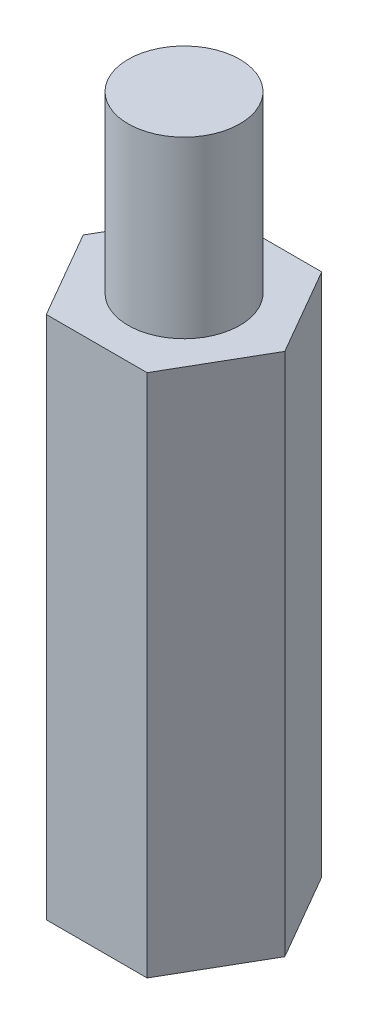
ISO-10303-21;
HEADER;
FILE_DESCRIPTION(('STEP AP214'),'2;1');
FILE_NAME('part.step','',(''),(''),'','','');
FILE_SCHEMA(('AUTOMOTIVE_DESIGN { 1 0 10303 214 1 1 1 1 }'));
ENDSEC;
DATA;
#1=APPLICATION_CONTEXT('core data for automotive mechanical design processes');
#2=APPLICATION_PROTOCOL_DEFINITION('international standard','automotive_design',2000,#1);
#3=PRODUCT_CONTEXT('',#1,'mechanical');
#4=PRODUCT('Part','Part','',(#3));
#5=PRODUCT_RELATED_PRODUCT_CATEGORY('part','',(#4));
#6=PRODUCT_DEFINITION_FORMATION('','',#4);
#7=PRODUCT_DEFINITION_CONTEXT('part definition',#1,'design');
#8=PRODUCT_DEFINITION('design','',#6,#7);
#9=PRODUCT_DEFINITION_SHAPE('','',#8);
#10=(LENGTH_UNIT() NAMED_UNIT(*) SI_UNIT(.MILLI.,.METRE.));
#11=(NAMED_UNIT(*) PLANE_ANGLE_UNIT() SI_UNIT($,.RADIAN.));
#12=(NAMED_UNIT(*) SI_UNIT($,.STERADIAN.) SOLID_ANGLE_UNIT());
#13=UNCERTAINTY_MEASURE_WITH_UNIT(LENGTH_MEASURE(1.E-05),#10,'distance_accuracy_value','');
#14=(GEOMETRIC_REPRESENTATION_CONTEXT(3) GLOBAL_UNCERTAINTY_ASSIGNED_CONTEXT((#13)) GLOBAL_UNIT_ASSIGNED_CONTEXT((#10,
#11,#12)) REPRESENTATION_CONTEXT('',''));
#15=CARTESIAN_POINT('',(0.,0.,0.));
#16=DIRECTION('',(0.,0.,1.));
#17=DIRECTION('',(1.,0.,0.));
#18=AXIS2_PLACEMENT_3D('',#15,#16,#17);
#19=CARTESIAN_POINT('',(-2.74963065701553,14.3002,0.));
#20=DIRECTION('',(0.866025403784445,0.,0.499999999999989));
#21=DIRECTION('',(0.499999999999989,0.,-0.866025403784445));
#22=AXIS2_PLACEMENT_3D('',#19,#20,#21);
#23=PLANE('',#22);
#24=DIRECTION('',(-0.499999999999989,0.,0.866025403784445));
#25=VECTOR('',#24,1.);
#26=CARTESIAN_POINT('',(-2.74963065701553,0.,0.));
#27=LINE('',#26,#25);
#28=CARTESIAN_POINT('',(-1.37481532850777,0.,-2.38124999999999));
#29=VERTEX_POINT('',#28);
#30=CARTESIAN_POINT('',(-2.74963065701553,0.,0.));
#31=VERTEX_POINT('',#30);
#32=EDGE_CURVE('E119',#29,#31,#27,.T.);
#33=ORIENTED_EDGE('',*,*,#32,.T.);
#34=DIRECTION('',(0.,-1.,0.));
#35=VECTOR('',#34,1.);
#36=CARTESIAN_POINT('',(-2.74963065701553,14.3002,0.));
#37=LINE('',#36,#35);
#38=CARTESIAN_POINT('',(-2.74963065701553,14.3002,0.));
#39=VERTEX_POINT('',#38);
#40=EDGE_CURVE('E36',#39,#31,#37,.T.);
#41=ORIENTED_EDGE('',*,*,#40,.F.);
#42=DIRECTION('',(-0.499999999999989,0.,0.866025403784445));
#43=VECTOR('',#42,1.);
#44=CARTESIAN_POINT('',(-2.74963065701553,14.3002,0.));
#45=LINE('',#44,#43);
#46=CARTESIAN_POINT('',(-1.37481532850777,14.3002,-2.38124999999999));
#47=VERTEX_POINT('',#46);
#48=EDGE_CURVE('E130',#47,#39,#45,.T.);
#49=ORIENTED_EDGE('',*,*,#48,.F.);
#50=DIRECTION('',(0.,-1.,0.));
#51=VECTOR('',#50,1.);
#52=CARTESIAN_POINT('',(-1.37481532850777,14.3002,-2.38124999999999));
#53=LINE('',#52,#51);
#54=EDGE_CURVE('E115',#47,#29,#53,.T.);
#55=ORIENTED_EDGE('',*,*,#54,.T.);
#56=EDGE_LOOP('',(#33,#41,#49,#55));
#57=FACE_BOUND('',#56,.T.);
#58=ADVANCED_FACE('F33',(#57),#23,.F.);
#59=CARTESIAN_POINT('',(-1.37481532850777,14.3002,2.38125000000002));
#60=DIRECTION('',(0.866025403784446,0.,-0.499999999999988));
#61=DIRECTION('',(-0.499999999999988,0.,-0.866025403784446));
#62=AXIS2_PLACEMENT_3D('',#59,#60,#61);
#63=PLANE('',#62);
#64=DIRECTION('',(0.499999999999988,0.,0.866025403784446));
#65=VECTOR('',#64,1.);
#66=CARTESIAN_POINT('',(-1.37481532850777,0.,2.38125000000002));
#67=LINE('',#66,#65);
#68=CARTESIAN_POINT('',(-1.37481532850777,0.,2.38125000000002));
#69=VERTEX_POINT('',#68);
#70=EDGE_CURVE('E122',#31,#69,#67,.T.);
#71=ORIENTED_EDGE('',*,*,#70,.T.);
#72=DIRECTION('',(0.,-1.,0.));
#73=VECTOR('',#72,1.);
#74=CARTESIAN_POINT('',(-1.37481532850777,14.3002,2.38125000000002));
#75=LINE('',#74,#73);
#76=CARTESIAN_POINT('',(-1.37481532850777,14.3002,2.38125000000002));
#77=VERTEX_POINT('',#76);
#78=EDGE_CURVE('E133',#77,#69,#75,.T.);
#79=ORIENTED_EDGE('',*,*,#78,.F.);
#80=DIRECTION('',(0.499999999999988,0.,0.866025403784446));
#81=VECTOR('',#80,1.);
#82=CARTESIAN_POINT('',(-1.37481532850777,14.3002,2.38125000000002));
#83=LINE('',#82,#81);
#84=EDGE_CURVE('E88',#39,#77,#83,.T.);
#85=ORIENTED_EDGE('',*,*,#84,.F.);
#86=ORIENTED_EDGE('',*,*,#40,.T.);
#87=EDGE_LOOP('',(#71,#79,#85,#86));
#88=FACE_BOUND('',#87,.T.);
#89=ADVANCED_FACE('F138',(#88),#63,.F.);
#90=CARTESIAN_POINT('',(1.3748153285078,14.3002,2.38125000000002));
#91=DIRECTION('',(0.,0.,-1.));
#92=DIRECTION('',(-1.,0.,0.));
#93=AXIS2_PLACEMENT_3D('',#90,#91,#92);
#94=PLANE('',#93);
#95=DIRECTION('',(1.,0.,0.));
#96=VECTOR('',#95,1.);
#97=CARTESIAN_POINT('',(1.3748153285078,0.,2.38125000000002));
#98=LINE('',#97,#96);
#99=CARTESIAN_POINT('',(1.3748153285078,0.,2.38125000000002));
#100=VERTEX_POINT('',#99);
#101=EDGE_CURVE('E125',#69,#100,#98,.T.);
#102=ORIENTED_EDGE('',*,*,#101,.T.);
#103=DIRECTION('',(0.,-1.,0.));
#104=VECTOR('',#103,1.);
#105=CARTESIAN_POINT('',(1.3748153285078,14.3002,2.38125000000002));
#106=LINE('',#105,#104);
#107=CARTESIAN_POINT('',(1.3748153285078,14.3002,2.38125000000002));
#108=VERTEX_POINT('',#107);
#109=EDGE_CURVE('E110',#108,#100,#106,.T.);
#110=ORIENTED_EDGE('',*,*,#109,.F.);
#111=DIRECTION('',(1.,0.,0.));
#112=VECTOR('',#111,1.);
#113=CARTESIAN_POINT('',(1.3748153285078,14.3002,2.38125000000002));
#114=LINE('',#113,#112);
#115=EDGE_CURVE('E101',#77,#108,#114,.T.);
#116=ORIENTED_EDGE('',*,*,#115,.F.);
#117=ORIENTED_EDGE('',*,*,#78,.T.);
#118=EDGE_LOOP('',(#102,#110,#116,#117));
#119=FACE_BOUND('',#118,.T.);
#120=ADVANCED_FACE('F144',(#119),#94,.F.);
#121=CARTESIAN_POINT('',(2.74963065701557,14.3002,0.));
#122=DIRECTION('',(-0.866025403784444,0.,-0.499999999999991));
#123=DIRECTION('',(-0.499999999999991,0.,0.866025403784444));
#124=AXIS2_PLACEMENT_3D('',#121,#122,#123);
#125=PLANE('',#124);
#126=DIRECTION('',(0.499999999999991,0.,-0.866025403784444));
#127=VECTOR('',#126,1.);
#128=CARTESIAN_POINT('',(2.74963065701557,0.,0.));
#129=LINE('',#128,#127);
#130=CARTESIAN_POINT('',(2.74963065701557,0.,0.));
#131=VERTEX_POINT('',#130);
#132=EDGE_CURVE('E109',#100,#131,#129,.T.);
#133=ORIENTED_EDGE('',*,*,#132,.T.);
#134=DIRECTION('',(0.,-1.,0.));
#135=VECTOR('',#134,1.);
#136=CARTESIAN_POINT('',(2.74963065701557,14.3002,0.));
#137=LINE('',#136,#135);
#138=CARTESIAN_POINT('',(2.74963065701557,14.3002,0.));
#139=VERTEX_POINT('',#138);
#140=EDGE_CURVE('E106',#139,#131,#137,.T.);
#141=ORIENTED_EDGE('',*,*,#140,.F.);
#142=DIRECTION('',(0.499999999999991,0.,-0.866025403784444));
#143=VECTOR('',#142,1.);
#144=CARTESIAN_POINT('',(2.74963065701557,14.3002,0.));
#145=LINE('',#144,#143);
#146=EDGE_CURVE('E95',#108,#139,#145,.T.);
#147=ORIENTED_EDGE('',*,*,#146,.F.);
#148=ORIENTED_EDGE('',*,*,#109,.T.);
#149=EDGE_LOOP('',(#133,#141,#147,#148));
#150=FACE_BOUND('',#149,.T.);
#151=ADVANCED_FACE('F107',(#150),#125,.F.);
#152=CARTESIAN_POINT('',(1.3748153285078,14.3002,-2.38124999999999));
#153=DIRECTION('',(-0.866025403784443,0.,0.499999999999992));
#154=DIRECTION('',(0.499999999999992,0.,0.866025403784443));
#155=AXIS2_PLACEMENT_3D('',#152,#153,#154);
#156=PLANE('',#155);
#157=DIRECTION('',(-0.499999999999993,0.,-0.866025403784443));
#158=VECTOR('',#157,1.);
#159=CARTESIAN_POINT('',(1.3748153285078,0.,-2.38124999999999));
#160=LINE('',#159,#158);
#161=CARTESIAN_POINT('',(1.3748153285078,0.,-2.38124999999999));
#162=VERTEX_POINT('',#161);
#163=EDGE_CURVE('E73',#131,#162,#160,.T.);
#164=ORIENTED_EDGE('',*,*,#163,.T.);
#165=DIRECTION('',(0.,-1.,0.));
#166=VECTOR('',#165,1.);
#167=CARTESIAN_POINT('',(1.3748153285078,14.3002,-2.38124999999999));
#168=LINE('',#167,#166);
#169=CARTESIAN_POINT('',(1.3748153285078,14.3002,-2.38124999999999));
#170=VERTEX_POINT('',#169);
#171=EDGE_CURVE('E111',#170,#162,#168,.T.);
#172=ORIENTED_EDGE('',*,*,#171,.F.);
#173=DIRECTION('',(-0.499999999999993,0.,-0.866025403784443));
#174=VECTOR('',#173,1.);
#175=CARTESIAN_POINT('',(1.3748153285078,14.3002,-2.38124999999999));
#176=LINE('',#175,#174);
#177=EDGE_CURVE('E99',#139,#170,#176,.T.);
#178=ORIENTED_EDGE('',*,*,#177,.F.);
#179=ORIENTED_EDGE('',*,*,#140,.T.);
#180=EDGE_LOOP('',(#164,#172,#178,#179));
#181=FACE_BOUND('',#180,.T.);
#182=ADVANCED_FACE('F113',(#181),#156,.F.);
#183=CARTESIAN_POINT('',(-1.37481532850777,14.3002,-2.38124999999999));
#184=DIRECTION('',(0.,0.,1.));
#185=DIRECTION('',(1.,0.,0.));
#186=AXIS2_PLACEMENT_3D('',#183,#184,#185);
#187=PLANE('',#186);
#188=DIRECTION('',(-1.,0.,0.));
#189=VECTOR('',#188,1.);
#190=CARTESIAN_POINT('',(-1.37481532850777,0.,-2.38124999999999));
#191=LINE('',#190,#189);
#192=EDGE_CURVE('E79',#162,#29,#191,.T.);
#193=ORIENTED_EDGE('',*,*,#192,.T.);
#194=ORIENTED_EDGE('',*,*,#54,.F.);
#195=DIRECTION('',(-1.,0.,0.));
#196=VECTOR('',#195,1.);
#197=CARTESIAN_POINT('',(-1.37481532850777,14.3002,-2.38124999999999));
#198=LINE('',#197,#196);
#199=EDGE_CURVE('E50',#170,#47,#198,.T.);
#200=ORIENTED_EDGE('',*,*,#199,.F.);
#201=ORIENTED_EDGE('',*,*,#171,.T.);
#202=EDGE_LOOP('',(#193,#194,#200,#201));
#203=FACE_BOUND('',#202,.T.);
#204=ADVANCED_FACE('F175',(#203),#187,.F.);
#205=CARTESIAN_POINT('',(0.,14.3002,0.));
#206=DIRECTION('',(0.,-1.,0.));
#207=DIRECTION('',(0.,0.,-1.));
#208=AXIS2_PLACEMENT_3D('',#205,#206,#207);
#209=PLANE('',#208);
#210=CARTESIAN_POINT('',(0.,14.3002,0.));
#211=DIRECTION('',(0.,1.,0.));
#212=DIRECTION('',(0.,0.,1.));
#213=AXIS2_PLACEMENT_3D('',#210,#211,#212);
#214=CIRCLE('',#213,1.524);
#215=CARTESIAN_POINT('',(0.,14.3002,-1.524));
#216=VERTEX_POINT('',#215);
#217=EDGE_CURVE('E11',#216,#216,#214,.T.);
#218=ORIENTED_EDGE('',*,*,#217,.F.);
#219=EDGE_LOOP('',(#218));
#220=FACE_BOUND('',#219,.T.);
#221=ORIENTED_EDGE('',*,*,#48,.T.);
#222=ORIENTED_EDGE('',*,*,#84,.T.);
#223=ORIENTED_EDGE('',*,*,#115,.T.);
#224=ORIENTED_EDGE('',*,*,#146,.T.);
#225=ORIENTED_EDGE('',*,*,#177,.T.);
#226=ORIENTED_EDGE('',*,*,#199,.T.);
#227=EDGE_LOOP('',(#221,#222,#223,#224,#225,#226));
#228=FACE_BOUND('',#227,.T.);
#229=ADVANCED_FACE('F97',(#220,#228),#209,.F.);
#230=CARTESIAN_POINT('',(0.,0.,0.));
#231=DIRECTION('',(0.,-1.,0.));
#232=DIRECTION('',(0.,0.,-1.));
#233=AXIS2_PLACEMENT_3D('',#230,#231,#232);
#234=PLANE('',#233);
#235=CARTESIAN_POINT('',(0.,0.,0.));
#236=DIRECTION('',(0.,-1.,0.));
#237=DIRECTION('',(0.,0.,-1.));
#238=AXIS2_PLACEMENT_3D('',#235,#236,#237);
#239=CIRCLE('',#238,0.79375);
#240=CARTESIAN_POINT('',(0.,0.,-0.79375));
#241=VERTEX_POINT('',#240);
#242=EDGE_CURVE('E151',#241,#241,#239,.T.);
#243=ORIENTED_EDGE('',*,*,#242,.F.);
#244=EDGE_LOOP('',(#243));
#245=FACE_BOUND('',#244,.T.);
#246=ORIENTED_EDGE('',*,*,#32,.F.);
#247=ORIENTED_EDGE('',*,*,#192,.F.);
#248=ORIENTED_EDGE('',*,*,#163,.F.);
#249=ORIENTED_EDGE('',*,*,#132,.F.);
#250=ORIENTED_EDGE('',*,*,#101,.F.);
#251=ORIENTED_EDGE('',*,*,#70,.F.);
#252=EDGE_LOOP('',(#246,#247,#248,#249,#250,#251));
#253=FACE_BOUND('',#252,.T.);
#254=ADVANCED_FACE('F143',(#245,#253),#234,.T.);
#255=CARTESIAN_POINT('',(0.,19.0627,0.));
#256=DIRECTION('',(0.,-1.,0.));
#257=DIRECTION('',(0.,0.,-1.));
#258=AXIS2_PLACEMENT_3D('',#255,#256,#257);
#259=CYLINDRICAL_SURFACE('',#258,1.524);
#260=CARTESIAN_POINT('',(0.,19.0627,0.));
#261=DIRECTION('',(0.,1.,0.));
#262=DIRECTION('',(0.,0.,1.));
#263=AXIS2_PLACEMENT_3D('',#260,#261,#262);
#264=CIRCLE('',#263,1.524);
#265=CARTESIAN_POINT('',(0.,19.0627,-1.524));
#266=VERTEX_POINT('',#265);
#267=EDGE_CURVE('E123',#266,#266,#264,.T.);
#268=CARTESIAN_POINT('',(0.,19.0627,-1.524));
#269=CARTESIAN_POINT('',(0.,19.013090625,-1.524));
#270=CARTESIAN_POINT('',(0.,18.96348125,-1.524));
#271=CARTESIAN_POINT('',(0.,18.8642625,-1.524));
#272=CARTESIAN_POINT('',(0.,18.814653125,-1.524));
#273=CARTESIAN_POINT('',(0.,18.715434375,-1.524));
#274=CARTESIAN_POINT('',(0.,18.665825,-1.524));
#275=CARTESIAN_POINT('',(0.,18.56660625,-1.524));
#276=CARTESIAN_POINT('',(0.,18.516996875,-1.524));
#277=CARTESIAN_POINT('',(0.,18.417778125,-1.524));
#278=CARTESIAN_POINT('',(0.,18.36816875,-1.524));
#279=CARTESIAN_POINT('',(0.,18.26895,-1.524));
#280=CARTESIAN_POINT('',(0.,18.219340625,-1.524));
#281=CARTESIAN_POINT('',(0.,18.120121875,-1.524));
#282=CARTESIAN_POINT('',(0.,18.0705125,-1.524));
#283=CARTESIAN_POINT('',(0.,17.97129375,-1.524));
#284=CARTESIAN_POINT('',(0.,17.921684375,-1.524));
#285=CARTESIAN_POINT('',(0.,17.822465625,-1.524));
#286=CARTESIAN_POINT('',(0.,17.77285625,-1.524));
#287=CARTESIAN_POINT('',(0.,17.6736375,-1.524));
#288=CARTESIAN_POINT('',(0.,17.624028125,-1.524));
#289=CARTESIAN_POINT('',(0.,17.524809375,-1.524));
#290=CARTESIAN_POINT('',(0.,17.4752,-1.524));
#291=CARTESIAN_POINT('',(0.,17.37598125,-1.524));
#292=CARTESIAN_POINT('',(0.,17.326371875,-1.524));
#293=CARTESIAN_POINT('',(0.,17.227153125,-1.524));
#294=CARTESIAN_POINT('',(0.,17.17754375,-1.524));
#295=CARTESIAN_POINT('',(0.,17.078325,-1.524));
#296=CARTESIAN_POINT('',(0.,17.028715625,-1.524));
#297=CARTESIAN_POINT('',(0.,16.929496875,-1.524));
#298=CARTESIAN_POINT('',(0.,16.8798875,-1.524));
#299=CARTESIAN_POINT('',(0.,16.78066875,-1.524));
#300=CARTESIAN_POINT('',(0.,16.731059375,-1.524));
#301=CARTESIAN_POINT('',(0.,16.631840625,-1.524));
#302=CARTESIAN_POINT('',(0.,16.58223125,-1.524));
#303=CARTESIAN_POINT('',(0.,16.4830125,-1.524));
#304=CARTESIAN_POINT('',(0.,16.433403125,-1.524));
#305=CARTESIAN_POINT('',(0.,16.334184375,-1.524));
#306=CARTESIAN_POINT('',(0.,16.284575,-1.524));
#307=CARTESIAN_POINT('',(0.,16.18535625,-1.524));
#308=CARTESIAN_POINT('',(0.,16.135746875,-1.524));
#309=CARTESIAN_POINT('',(0.,16.036528125,-1.524));
#310=CARTESIAN_POINT('',(0.,15.98691875,-1.524));
#311=CARTESIAN_POINT('',(0.,15.8877,-1.524));
#312=CARTESIAN_POINT('',(0.,15.838090625,-1.524));
#313=CARTESIAN_POINT('',(0.,15.738871875,-1.524));
#314=CARTESIAN_POINT('',(0.,15.6892625,-1.524));
#315=CARTESIAN_POINT('',(0.,15.59004375,-1.524));
#316=CARTESIAN_POINT('',(0.,15.540434375,-1.524));
#317=CARTESIAN_POINT('',(0.,15.441215625,-1.524));
#318=CARTESIAN_POINT('',(0.,15.39160625,-1.524));
#319=CARTESIAN_POINT('',(0.,15.2923875,-1.524));
#320=CARTESIAN_POINT('',(0.,15.242778125,-1.524));
#321=CARTESIAN_POINT('',(0.,15.143559375,-1.524));
#322=CARTESIAN_POINT('',(0.,15.09395,-1.524));
#323=CARTESIAN_POINT('',(0.,14.99473125,-1.524));
#324=CARTESIAN_POINT('',(0.,14.945121875,-1.524));
#325=CARTESIAN_POINT('',(0.,14.845903125,-1.524));
#326=CARTESIAN_POINT('',(0.,14.79629375,-1.524));
#327=CARTESIAN_POINT('',(0.,14.697075,-1.524));
#328=CARTESIAN_POINT('',(0.,14.647465625,-1.524));
#329=CARTESIAN_POINT('',(0.,14.548246875,-1.524));
#330=CARTESIAN_POINT('',(0.,14.4986375,-1.524));
#331=CARTESIAN_POINT('',(0.,14.39941875,-1.524));
#332=CARTESIAN_POINT('',(0.,14.349809375,-1.524));
#333=CARTESIAN_POINT('',(0.,14.3002,-1.524));
#334=B_SPLINE_CURVE_WITH_KNOTS('',3,(#268,#269,#270,#271,#272,#273,#274,#275,#276,#277,#278,
#279,#280,#281,#282,#283,#284,#285,#286,#287,#288,#289,#290,#291,#292,#293,#294,#295,#296,#297,
#298,#299,#300,#301,#302,#303,#304,#305,#306,#307,#308,#309,#310,#311,#312,#313,#314,#315,#316,
#317,#318,#319,#320,#321,#322,#323,#324,#325,#326,#327,#328,#329,#330,#331,#332,#333),
.UNSPECIFIED.,.F.,.F.,(4,2,2,2,2,2,2,2,2,2,2,2,2,2,2,2,2,2,2,2,2,2,2,2,2,2,2,2,2,2,2,2,4),(0.,
0.148828125,0.29765625,0.446484375,0.5953125,0.744140625,0.892968750000001,1.041796875,1.190625,
1.339453125,1.48828125,1.637109375,1.7859375,1.934765625,2.08359375,2.232421875,2.38125,
2.530078125,2.67890625,2.827734375,2.9765625,3.125390625,3.27421875,3.423046875,3.571875,
3.720703125,3.86953125,4.018359375,4.1671875,4.316015625,4.46484375,4.613671875,4.7625),.UNSPECIFIED.);
#335=EDGE_CURVE('BSEAM167',#266,#216,#334,.T.);
#336=ORIENTED_EDGE('',*,*,#267,.F.);
#337=ORIENTED_EDGE('',*,*,#217,.T.);
#338=ORIENTED_EDGE('',*,*,#335,.T.);
#339=ORIENTED_EDGE('',*,*,#335,.F.);
#340=EDGE_LOOP('',(#336,#338,#337,#339));
#341=FACE_BOUND('',#340,.T.);
#342=ADVANCED_FACE('F167',(#341),#259,.T.);
#343=CARTESIAN_POINT('',(0.,19.0627,0.));
#344=DIRECTION('',(0.,1.,0.));
#345=DIRECTION('',(0.,0.,1.));
#346=AXIS2_PLACEMENT_3D('',#343,#344,#345);
#347=PLANE('',#346);
#348=ORIENTED_EDGE('',*,*,#267,.T.);
#349=EDGE_LOOP('',(#348));
#350=FACE_BOUND('',#349,.T.);
#351=ADVANCED_FACE('F162',(#350),#347,.T.);
#352=CARTESIAN_POINT('',(0.,4.7625,0.));
#353=DIRECTION('',(0.,-1.,0.));
#354=DIRECTION('',(0.,0.,-1.));
#355=AXIS2_PLACEMENT_3D('',#352,#353,#354);
#356=CYLINDRICAL_SURFACE('',#355,0.79375);
#357=CARTESIAN_POINT('',(0.,4.7625,0.));
#358=DIRECTION('',(0.,-1.,0.));
#359=DIRECTION('',(0.,0.,-1.));
#360=AXIS2_PLACEMENT_3D('',#357,#358,#359);
#361=CIRCLE('',#360,0.79375);
#362=CARTESIAN_POINT('',(0.,4.7625,-0.79375));
#363=VERTEX_POINT('',#362);
#364=EDGE_CURVE('E150',#363,#363,#361,.T.);
#365=CARTESIAN_POINT('',(0.,4.7625,-0.79375));
#366=CARTESIAN_POINT('',(0.,4.712890625,-0.79375));
#367=CARTESIAN_POINT('',(0.,4.66328125,-0.79375));
#368=CARTESIAN_POINT('',(0.,4.5640625,-0.79375));
#369=CARTESIAN_POINT('',(0.,4.514453125,-0.79375));
#370=CARTESIAN_POINT('',(0.,4.415234375,-0.79375));
#371=CARTESIAN_POINT('',(0.,4.365625,-0.79375));
#372=CARTESIAN_POINT('',(0.,4.26640625,-0.79375));
#373=CARTESIAN_POINT('',(0.,4.216796875,-0.79375));
#374=CARTESIAN_POINT('',(0.,4.117578125,-0.79375));
#375=CARTESIAN_POINT('',(0.,4.06796875,-0.79375));
#376=CARTESIAN_POINT('',(0.,3.96875,-0.79375));
#377=CARTESIAN_POINT('',(0.,3.919140625,-0.79375));
#378=CARTESIAN_POINT('',(0.,3.819921875,-0.79375));
#379=CARTESIAN_POINT('',(0.,3.7703125,-0.79375));
#380=CARTESIAN_POINT('',(0.,3.67109375,-0.79375));
#381=CARTESIAN_POINT('',(0.,3.621484375,-0.79375));
#382=CARTESIAN_POINT('',(0.,3.522265625,-0.79375));
#383=CARTESIAN_POINT('',(0.,3.47265625,-0.79375));
#384=CARTESIAN_POINT('',(0.,3.3734375,-0.79375));
#385=CARTESIAN_POINT('',(0.,3.323828125,-0.79375));
#386=CARTESIAN_POINT('',(0.,3.224609375,-0.79375));
#387=CARTESIAN_POINT('',(0.,3.175,-0.79375));
#388=CARTESIAN_POINT('',(0.,3.07578125,-0.79375));
#389=CARTESIAN_POINT('',(0.,3.026171875,-0.79375));
#390=CARTESIAN_POINT('',(0.,2.926953125,-0.79375));
#391=CARTESIAN_POINT('',(0.,2.87734375,-0.79375));
#392=CARTESIAN_POINT('',(0.,2.778125,-0.79375));
#393=CARTESIAN_POINT('',(0.,2.728515625,-0.79375));
#394=CARTESIAN_POINT('',(0.,2.629296875,-0.79375));
#395=CARTESIAN_POINT('',(0.,2.5796875,-0.79375));
#396=CARTESIAN_POINT('',(0.,2.48046875,-0.79375));
#397=CARTESIAN_POINT('',(0.,2.430859375,-0.79375));
#398=CARTESIAN_POINT('',(0.,2.331640625,-0.79375));
#399=CARTESIAN_POINT('',(0.,2.28203125,-0.79375));
#400=CARTESIAN_POINT('',(0.,2.1828125,-0.79375));
#401=CARTESIAN_POINT('',(0.,2.133203125,-0.79375));
#402=CARTESIAN_POINT('',(0.,2.033984375,-0.79375));
#403=CARTESIAN_POINT('',(0.,1.984375,-0.79375));
#404=CARTESIAN_POINT('',(0.,1.88515625,-0.79375));
#405=CARTESIAN_POINT('',(0.,1.835546875,-0.79375));
#406=CARTESIAN_POINT('',(0.,1.736328125,-0.79375));
#407=CARTESIAN_POINT('',(0.,1.68671875,-0.79375));
#408=CARTESIAN_POINT('',(0.,1.5875,-0.79375));
#409=CARTESIAN_POINT('',(0.,1.537890625,-0.79375));
#410=CARTESIAN_POINT('',(0.,1.438671875,-0.79375));
#411=CARTESIAN_POINT('',(0.,1.3890625,-0.79375));
#412=CARTESIAN_POINT('',(0.,1.28984375,-0.79375));
#413=CARTESIAN_POINT('',(0.,1.240234375,-0.79375));
#414=CARTESIAN_POINT('',(0.,1.141015625,-0.79375));
#415=CARTESIAN_POINT('',(0.,1.09140625,-0.79375));
#416=CARTESIAN_POINT('',(0.,0.9921875,-0.79375));
#417=CARTESIAN_POINT('',(0.,0.942578125,-0.79375));
#418=CARTESIAN_POINT('',(0.,0.843359375,-0.79375));
#419=CARTESIAN_POINT('',(0.,0.79375,-0.79375));
#420=CARTESIAN_POINT('',(0.,0.69453125,-0.79375));
#421=CARTESIAN_POINT('',(0.,0.644921875,-0.79375));
#422=CARTESIAN_POINT('',(0.,0.545703125,-0.79375));
#423=CARTESIAN_POINT('',(0.,0.49609375,-0.79375));
#424=CARTESIAN_POINT('',(0.,0.396875,-0.79375));
#425=CARTESIAN_POINT('',(0.,0.347265625,-0.79375));
#426=CARTESIAN_POINT('',(0.,0.248046875,-0.79375));
#427=CARTESIAN_POINT('',(0.,0.1984375,-0.79375));
#428=CARTESIAN_POINT('',(0.,0.09921875,-0.79375));
#429=CARTESIAN_POINT('',(0.,0.049609375,-0.79375));
#430=CARTESIAN_POINT('',(0.,0.,-0.79375));
#431=B_SPLINE_CURVE_WITH_KNOTS('',3,(#365,#366,#367,#368,#369,#370,#371,#372,#373,#374,#375,
#376,#377,#378,#379,#380,#381,#382,#383,#384,#385,#386,#387,#388,#389,#390,#391,#392,#393,#394,
#395,#396,#397,#398,#399,#400,#401,#402,#403,#404,#405,#406,#407,#408,#409,#410,#411,#412,#413,
#414,#415,#416,#417,#418,#419,#420,#421,#422,#423,#424,#425,#426,#427,#428,#429,#430),
.UNSPECIFIED.,.F.,.F.,(4,2,2,2,2,2,2,2,2,2,2,2,2,2,2,2,2,2,2,2,2,2,2,2,2,2,2,2,2,2,2,2,4),(0.,
0.148828125,0.29765625,0.446484375,0.5953125,0.744140625,0.892968750000001,1.041796875,1.190625,
1.339453125,1.48828125,1.637109375,1.7859375,1.934765625,2.08359375,2.232421875,2.38125,
2.530078125,2.67890625,2.827734375,2.9765625,3.125390625,3.27421875,3.423046875,3.571875,
3.720703125,3.86953125,4.018359375,4.1671875,4.316015625,4.46484375,4.613671875,4.7625),.UNSPECIFIED.);
#432=EDGE_CURVE('BSEAM159',#363,#241,#431,.T.);
#433=ORIENTED_EDGE('',*,*,#364,.F.);
#434=ORIENTED_EDGE('',*,*,#242,.T.);
#435=ORIENTED_EDGE('',*,*,#432,.T.);
#436=ORIENTED_EDGE('',*,*,#432,.F.);
#437=EDGE_LOOP('',(#433,#435,#434,#436));
#438=FACE_BOUND('',#437,.T.);
#439=ADVANCED_FACE('F159',(#438),#356,.F.);
#440=CARTESIAN_POINT('',(0.,4.7625,0.));
#441=DIRECTION('',(0.,-1.,0.));
#442=DIRECTION('',(0.,0.,-1.));
#443=AXIS2_PLACEMENT_3D('',#440,#441,#442);
#444=PLANE('',#443);
#445=ORIENTED_EDGE('',*,*,#364,.T.);
#446=EDGE_LOOP('',(#445));
#447=FACE_BOUND('',#446,.T.);
#448=ADVANCED_FACE('F157',(#447),#444,.T.);
#449=CLOSED_SHELL('',(#58,#89,#120,#151,#182,#204,#229,#254,#342,#351,#439,#448));
#450=MANIFOLD_SOLID_BREP('B2',#449);
#451=ADVANCED_BREP_SHAPE_REPRESENTATION('',(#18,#450),#14);
#452=SHAPE_DEFINITION_REPRESENTATION(#9,#451);
ENDSEC;
END-ISO-10303-21;
